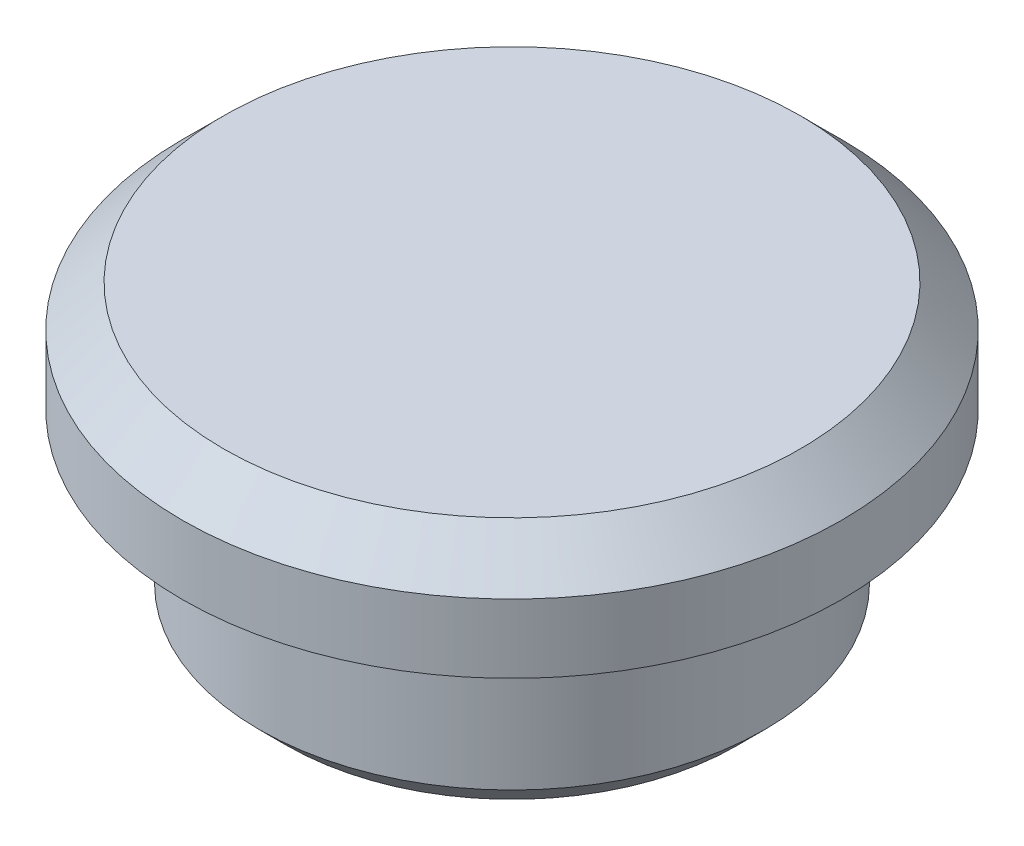
ISO-10303-21;
HEADER;
FILE_DESCRIPTION(('STEP AP214'),'2;1');
FILE_NAME('part.step','',(''),(''),'','','');
FILE_SCHEMA(('AUTOMOTIVE_DESIGN { 1 0 10303 214 1 1 1 1 }'));
ENDSEC;
DATA;
#1=APPLICATION_CONTEXT('core data for automotive mechanical design processes');
#2=APPLICATION_PROTOCOL_DEFINITION('international standard','automotive_design',2000,#1);
#3=PRODUCT_CONTEXT('',#1,'mechanical');
#4=PRODUCT('Part','Part','',(#3));
#5=PRODUCT_RELATED_PRODUCT_CATEGORY('part','',(#4));
#6=PRODUCT_DEFINITION_FORMATION('','',#4);
#7=PRODUCT_DEFINITION_CONTEXT('part definition',#1,'design');
#8=PRODUCT_DEFINITION('design','',#6,#7);
#9=PRODUCT_DEFINITION_SHAPE('','',#8);
#10=(LENGTH_UNIT() NAMED_UNIT(*) SI_UNIT(.MILLI.,.METRE.));
#11=(NAMED_UNIT(*) PLANE_ANGLE_UNIT() SI_UNIT($,.RADIAN.));
#12=(NAMED_UNIT(*) SI_UNIT($,.STERADIAN.) SOLID_ANGLE_UNIT());
#13=UNCERTAINTY_MEASURE_WITH_UNIT(LENGTH_MEASURE(1.E-05),#10,'distance_accuracy_value','');
#14=(GEOMETRIC_REPRESENTATION_CONTEXT(3) GLOBAL_UNCERTAINTY_ASSIGNED_CONTEXT((#13)) GLOBAL_UNIT_ASSIGNED_CONTEXT((#10,
#11,#12)) REPRESENTATION_CONTEXT('',''));
#15=CARTESIAN_POINT('',(0.,0.,0.));
#16=DIRECTION('',(0.,0.,1.));
#17=DIRECTION('',(1.,0.,0.));
#18=AXIS2_PLACEMENT_3D('',#15,#16,#17);
#19=CARTESIAN_POINT('',(0.,3.302,0.));
#20=DIRECTION('',(0.,-1.,0.));
#21=DIRECTION('',(0.,0.,-1.));
#22=AXIS2_PLACEMENT_3D('',#19,#20,#21);
#23=CYLINDRICAL_SURFACE('',#22,4.6736);
#24=CARTESIAN_POINT('',(0.,0.508000000000012,0.));
#25=DIRECTION('',(0.,1.,0.));
#26=DIRECTION('',(0.,0.,1.));
#27=AXIS2_PLACEMENT_3D('',#24,#25,#26);
#28=CIRCLE('',#27,4.6736);
#29=CARTESIAN_POINT('',(0.,0.508000000000012,-4.6736));
#30=VERTEX_POINT('',#29);
#31=EDGE_CURVE('E38',#30,#30,#28,.T.);
#32=CARTESIAN_POINT('',(0.,3.302,0.));
#33=DIRECTION('',(0.,1.,0.));
#34=DIRECTION('',(0.,0.,1.));
#35=AXIS2_PLACEMENT_3D('',#32,#33,#34);
#36=CIRCLE('',#35,4.6736);
#37=CARTESIAN_POINT('',(0.,3.302,-4.6736));
#38=VERTEX_POINT('',#37);
#39=EDGE_CURVE('E51',#38,#38,#36,.T.);
#40=CARTESIAN_POINT('',(0.,0.508000000000012,-4.6736));
#41=CARTESIAN_POINT('',(0.,0.537104166666678,-4.6736));
#42=CARTESIAN_POINT('',(0.,0.566208333333345,-4.6736));
#43=CARTESIAN_POINT('',(0.,0.624416666666678,-4.6736));
#44=CARTESIAN_POINT('',(0.,0.653520833333345,-4.6736));
#45=CARTESIAN_POINT('',(0.,0.711729166666678,-4.6736));
#46=CARTESIAN_POINT('',(0.,0.740833333333345,-4.6736));
#47=CARTESIAN_POINT('',(0.,0.799041666666678,-4.6736));
#48=CARTESIAN_POINT('',(0.,0.828145833333344,-4.6736));
#49=CARTESIAN_POINT('',(0.,0.886354166666677,-4.6736));
#50=CARTESIAN_POINT('',(0.,0.915458333333343,-4.6736));
#51=CARTESIAN_POINT('',(0.,0.973666666666677,-4.6736));
#52=CARTESIAN_POINT('',(0.,1.00277083333334,-4.6736));
#53=CARTESIAN_POINT('',(0.,1.06097916666668,-4.6736));
#54=CARTESIAN_POINT('',(0.,1.09008333333334,-4.6736));
#55=CARTESIAN_POINT('',(0.,1.14829166666668,-4.6736));
#56=CARTESIAN_POINT('',(0.,1.17739583333334,-4.6736));
#57=CARTESIAN_POINT('',(0.,1.23560416666668,-4.6736));
#58=CARTESIAN_POINT('',(0.,1.26470833333334,-4.6736));
#59=CARTESIAN_POINT('',(0.,1.32291666666667,-4.6736));
#60=CARTESIAN_POINT('',(0.,1.35202083333334,-4.6736));
#61=CARTESIAN_POINT('',(0.,1.41022916666667,-4.6736));
#62=CARTESIAN_POINT('',(0.,1.43933333333334,-4.6736));
#63=CARTESIAN_POINT('',(0.,1.49754166666667,-4.6736));
#64=CARTESIAN_POINT('',(0.,1.52664583333334,-4.6736));
#65=CARTESIAN_POINT('',(0.,1.58485416666667,-4.6736));
#66=CARTESIAN_POINT('',(0.,1.61395833333334,-4.6736));
#67=CARTESIAN_POINT('',(0.,1.67216666666667,-4.6736));
#68=CARTESIAN_POINT('',(0.,1.70127083333334,-4.6736));
#69=CARTESIAN_POINT('',(0.,1.75947916666667,-4.6736));
#70=CARTESIAN_POINT('',(0.,1.78858333333334,-4.6736));
#71=CARTESIAN_POINT('',(0.,1.84679166666667,-4.6736));
#72=CARTESIAN_POINT('',(0.,1.87589583333334,-4.6736));
#73=CARTESIAN_POINT('',(0.,1.93410416666667,-4.6736));
#74=CARTESIAN_POINT('',(0.,1.96320833333334,-4.6736));
#75=CARTESIAN_POINT('',(0.,2.02141666666667,-4.6736));
#76=CARTESIAN_POINT('',(0.,2.05052083333334,-4.6736));
#77=CARTESIAN_POINT('',(0.,2.10872916666667,-4.6736));
#78=CARTESIAN_POINT('',(0.,2.13783333333334,-4.6736));
#79=CARTESIAN_POINT('',(0.,2.19604166666667,-4.6736));
#80=CARTESIAN_POINT('',(0.,2.22514583333334,-4.6736));
#81=CARTESIAN_POINT('',(0.,2.28335416666667,-4.6736));
#82=CARTESIAN_POINT('',(0.,2.31245833333334,-4.6736));
#83=CARTESIAN_POINT('',(0.,2.37066666666667,-4.6736));
#84=CARTESIAN_POINT('',(0.,2.39977083333334,-4.6736));
#85=CARTESIAN_POINT('',(0.,2.45797916666667,-4.6736));
#86=CARTESIAN_POINT('',(0.,2.48708333333334,-4.6736));
#87=CARTESIAN_POINT('',(0.,2.54529166666667,-4.6736));
#88=CARTESIAN_POINT('',(0.,2.57439583333334,-4.6736));
#89=CARTESIAN_POINT('',(0.,2.63260416666667,-4.6736));
#90=CARTESIAN_POINT('',(0.,2.66170833333334,-4.6736));
#91=CARTESIAN_POINT('',(0.,2.71991666666667,-4.6736));
#92=CARTESIAN_POINT('',(0.,2.74902083333334,-4.6736));
#93=CARTESIAN_POINT('',(0.,2.80722916666667,-4.6736));
#94=CARTESIAN_POINT('',(0.,2.83633333333334,-4.6736));
#95=CARTESIAN_POINT('',(0.,2.89454166666667,-4.6736));
#96=CARTESIAN_POINT('',(0.,2.92364583333333,-4.6736));
#97=CARTESIAN_POINT('',(0.,2.98185416666667,-4.6736));
#98=CARTESIAN_POINT('',(0.,3.01095833333333,-4.6736));
#99=CARTESIAN_POINT('',(0.,3.06916666666667,-4.6736));
#100=CARTESIAN_POINT('',(0.,3.09827083333333,-4.6736));
#101=CARTESIAN_POINT('',(0.,3.15647916666667,-4.6736));
#102=CARTESIAN_POINT('',(0.,3.18558333333333,-4.6736));
#103=CARTESIAN_POINT('',(0.,3.24379166666667,-4.6736));
#104=CARTESIAN_POINT('',(0.,3.27289583333333,-4.6736));
#105=CARTESIAN_POINT('',(0.,3.302,-4.6736));
#106=B_SPLINE_CURVE_WITH_KNOTS('',3,(#40,#41,#42,#43,#44,#45,#46,#47,#48,#49,#50,#51,#52,#53,
#54,#55,#56,#57,#58,#59,#60,#61,#62,#63,#64,#65,#66,#67,#68,#69,#70,#71,#72,#73,#74,#75,#76,#77,
#78,#79,#80,#81,#82,#83,#84,#85,#86,#87,#88,#89,#90,#91,#92,#93,#94,#95,#96,#97,#98,#99,#100,
#101,#102,#103,#104,#105),.UNSPECIFIED.,.F.,.F.,(4,2,2,2,2,2,2,2,2,2,2,2,2,2,2,2,2,2,2,2,2,2,2,
2,2,2,2,2,2,2,2,2,4),(0.,0.0873124999999997,0.174624999999999,0.261937499999999,
0.349249999999998,0.436562499999998,0.523874999999998,0.611187499999998,0.698499999999997,
0.785812499999997,0.873124999999996,0.960437499999996,1.04775,1.13506249999999,1.22237499999999,
1.30968749999999,1.39699999999999,1.48431249999999,1.57162499999999,1.65893749999999,
1.74624999999999,1.83356249999999,1.92087499999999,2.00818749999999,2.09549999999999,
2.18281249999999,2.27012499999999,2.35743749999999,2.44474999999999,2.53206249999999,
2.61937499999999,2.70668749999999,2.79399999999999),.UNSPECIFIED.);
#107=EDGE_CURVE('BSEAM31',#30,#38,#106,.T.);
#108=ORIENTED_EDGE('',*,*,#31,.T.);
#109=ORIENTED_EDGE('',*,*,#39,.F.);
#110=ORIENTED_EDGE('',*,*,#107,.T.);
#111=ORIENTED_EDGE('',*,*,#107,.F.);
#112=EDGE_LOOP('',(#108,#110,#109,#111));
#113=FACE_BOUND('',#112,.T.);
#114=ADVANCED_FACE('F31',(#113),#23,.T.);
#115=CARTESIAN_POINT('',(0.,0.,0.));
#116=DIRECTION('',(0.,1.,0.));
#117=DIRECTION('',(0.,0.,1.));
#118=AXIS2_PLACEMENT_3D('',#115,#116,#117);
#119=PLANE('',#118);
#120=CARTESIAN_POINT('',(0.,0.,0.));
#121=DIRECTION('',(0.,1.,0.));
#122=DIRECTION('',(0.,0.,1.));
#123=AXIS2_PLACEMENT_3D('',#120,#121,#122);
#124=CIRCLE('',#123,4.16559999999999);
#125=CARTESIAN_POINT('',(0.,0.,4.16559999999999));
#126=VERTEX_POINT('',#125);
#127=EDGE_CURVE('E10',#126,#126,#124,.F.);
#128=ORIENTED_EDGE('',*,*,#127,.T.);
#129=EDGE_LOOP('',(#128));
#130=FACE_BOUND('',#129,.T.);
#131=ADVANCED_FACE('F75',(#130),#119,.F.);
#132=CARTESIAN_POINT('',(0.,5.334,0.));
#133=DIRECTION('',(0.,-1.,0.));
#134=DIRECTION('',(0.,0.,-1.));
#135=AXIS2_PLACEMENT_3D('',#132,#133,#134);
#136=CYLINDRICAL_SURFACE('',#135,6.096);
#137=CARTESIAN_POINT('',(0.,4.572,0.));
#138=DIRECTION('',(0.,1.,0.));
#139=DIRECTION('',(0.,0.,1.));
#140=AXIS2_PLACEMENT_3D('',#137,#138,#139);
#141=CIRCLE('',#140,6.096);
#142=CARTESIAN_POINT('',(0.,4.572,6.096));
#143=VERTEX_POINT('',#142);
#144=EDGE_CURVE('E42',#143,#143,#141,.F.);
#145=ORIENTED_EDGE('',*,*,#144,.T.);
#146=EDGE_LOOP('',(#145));
#147=FACE_BOUND('',#146,.T.);
#148=CARTESIAN_POINT('',(0.,3.302,0.));
#149=DIRECTION('',(0.,1.,0.));
#150=DIRECTION('',(0.,0.,1.));
#151=AXIS2_PLACEMENT_3D('',#148,#149,#150);
#152=CIRCLE('',#151,6.096);
#153=CARTESIAN_POINT('',(0.,3.302,6.096));
#154=VERTEX_POINT('',#153);
#155=EDGE_CURVE('E54',#154,#154,#152,.T.);
#156=ORIENTED_EDGE('',*,*,#155,.T.);
#157=EDGE_LOOP('',(#156));
#158=FACE_BOUND('',#157,.T.);
#159=ADVANCED_FACE('F58',(#147,#158),#136,.T.);
#160=CARTESIAN_POINT('',(0.,5.334,0.));
#161=DIRECTION('',(0.,1.,0.));
#162=DIRECTION('',(0.,0.,1.));
#163=AXIS2_PLACEMENT_3D('',#160,#161,#162);
#164=PLANE('',#163);
#165=CARTESIAN_POINT('',(0.,5.334,0.));
#166=DIRECTION('',(0.,1.,0.));
#167=DIRECTION('',(0.,0.,1.));
#168=AXIS2_PLACEMENT_3D('',#165,#166,#167);
#169=CIRCLE('',#168,5.334);
#170=CARTESIAN_POINT('',(0.,5.334,5.334));
#171=VERTEX_POINT('',#170);
#172=EDGE_CURVE('E46',#171,#171,#169,.T.);
#173=ORIENTED_EDGE('',*,*,#172,.T.);
#174=EDGE_LOOP('',(#173));
#175=FACE_BOUND('',#174,.T.);
#176=ADVANCED_FACE('F63',(#175),#164,.T.);
#177=CARTESIAN_POINT('',(0.,3.302,0.));
#178=DIRECTION('',(0.,1.,0.));
#179=DIRECTION('',(0.,0.,1.));
#180=AXIS2_PLACEMENT_3D('',#177,#178,#179);
#181=PLANE('',#180);
#182=ORIENTED_EDGE('',*,*,#39,.T.);
#183=EDGE_LOOP('',(#182));
#184=FACE_BOUND('',#183,.T.);
#185=ORIENTED_EDGE('',*,*,#155,.F.);
#186=EDGE_LOOP('',(#185));
#187=FACE_BOUND('',#186,.T.);
#188=ADVANCED_FACE('F60',(#184,#187),#181,.F.);
#189=CARTESIAN_POINT('',(0.,5.334,0.));
#190=DIRECTION('',(0.,-1.,0.));
#191=DIRECTION('',(0.,0.,-1.));
#192=AXIS2_PLACEMENT_3D('',#189,#190,#191);
#193=CONICAL_SURFACE('',#192,5.334,0.785398163397448);
#194=ORIENTED_EDGE('',*,*,#144,.F.);
#195=EDGE_LOOP('',(#194));
#196=FACE_BOUND('',#195,.T.);
#197=ORIENTED_EDGE('',*,*,#172,.F.);
#198=EDGE_LOOP('',(#197));
#199=FACE_BOUND('',#198,.T.);
#200=ADVANCED_FACE('F62',(#196,#199),#193,.T.);
#201=CARTESIAN_POINT('',(0.,0.508000000000012,0.));
#202=DIRECTION('',(0.,1.,0.));
#203=DIRECTION('',(0.,0.,1.));
#204=AXIS2_PLACEMENT_3D('',#201,#202,#203);
#205=CONICAL_SURFACE('',#204,4.6736,0.785398163397451);
#206=ORIENTED_EDGE('',*,*,#127,.F.);
#207=EDGE_LOOP('',(#206));
#208=FACE_BOUND('',#207,.T.);
#209=ORIENTED_EDGE('',*,*,#31,.F.);
#210=EDGE_LOOP('',(#209));
#211=FACE_BOUND('',#210,.T.);
#212=ADVANCED_FACE('F33',(#208,#211),#205,.T.);
#213=CLOSED_SHELL('',(#114,#131,#159,#176,#188,#200,#212));
#214=MANIFOLD_SOLID_BREP('B2',#213);
#215=ADVANCED_BREP_SHAPE_REPRESENTATION('',(#18,#214),#14);
#216=SHAPE_DEFINITION_REPRESENTATION(#9,#215);
ENDSEC;
END-ISO-10303-21;
